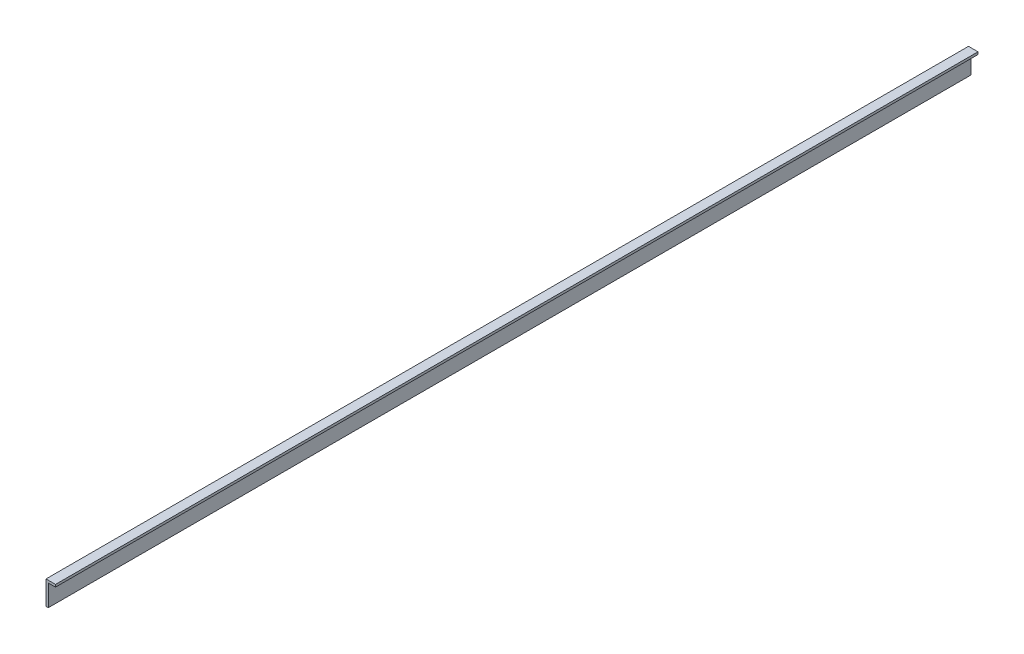
ISO-10303-21;
HEADER;
FILE_DESCRIPTION(('STEP AP214'),'2;1');
FILE_NAME('part.step','',(''),(''),'','','');
FILE_SCHEMA(('AUTOMOTIVE_DESIGN { 1 0 10303 214 1 1 1 1 }'));
ENDSEC;
DATA;
#1=APPLICATION_CONTEXT('core data for automotive mechanical design processes');
#2=APPLICATION_PROTOCOL_DEFINITION('international standard','automotive_design',2000,#1);
#3=PRODUCT_CONTEXT('',#1,'mechanical');
#4=PRODUCT('Part','Part','',(#3));
#5=PRODUCT_RELATED_PRODUCT_CATEGORY('part','',(#4));
#6=PRODUCT_DEFINITION_FORMATION('','',#4);
#7=PRODUCT_DEFINITION_CONTEXT('part definition',#1,'design');
#8=PRODUCT_DEFINITION('design','',#6,#7);
#9=PRODUCT_DEFINITION_SHAPE('','',#8);
#10=(LENGTH_UNIT() NAMED_UNIT(*) SI_UNIT(.MILLI.,.METRE.));
#11=(NAMED_UNIT(*) PLANE_ANGLE_UNIT() SI_UNIT($,.RADIAN.));
#12=(NAMED_UNIT(*) SI_UNIT($,.STERADIAN.) SOLID_ANGLE_UNIT());
#13=UNCERTAINTY_MEASURE_WITH_UNIT(LENGTH_MEASURE(1.E-05),#10,'distance_accuracy_value','');
#14=(GEOMETRIC_REPRESENTATION_CONTEXT(3) GLOBAL_UNCERTAINTY_ASSIGNED_CONTEXT((#13)) GLOBAL_UNIT_ASSIGNED_CONTEXT((#10,
#11,#12)) REPRESENTATION_CONTEXT('',''));
#15=CARTESIAN_POINT('',(0.,0.,0.));
#16=DIRECTION('',(0.,0.,1.));
#17=DIRECTION('',(1.,0.,0.));
#18=AXIS2_PLACEMENT_3D('',#15,#16,#17);
#19=CARTESIAN_POINT('',(-54.,18.,-797.5));
#20=DIRECTION('',(1.,0.,0.));
#21=DIRECTION('',(0.,0.,-1.));
#22=AXIS2_PLACEMENT_3D('',#19,#20,#21);
#23=PLANE('',#22);
#24=DIRECTION('',(0.,1.,0.));
#25=VECTOR('',#24,1.);
#26=CARTESIAN_POINT('',(-54.,18.,-20.));
#27=LINE('',#26,#25);
#28=CARTESIAN_POINT('',(-54.,0.,-20.));
#29=VERTEX_POINT('',#28);
#30=CARTESIAN_POINT('',(-54.,18.,-20.));
#31=VERTEX_POINT('',#30);
#32=EDGE_CURVE('E124',#29,#31,#27,.T.);
#33=ORIENTED_EDGE('',*,*,#32,.F.);
#34=DIRECTION('',(0.,0.,1.));
#35=VECTOR('',#34,1.);
#36=CARTESIAN_POINT('',(-54.,0.,-797.5));
#37=LINE('',#36,#35);
#38=CARTESIAN_POINT('',(-54.,0.,-797.5));
#39=VERTEX_POINT('',#38);
#40=EDGE_CURVE('E11',#39,#29,#37,.T.);
#41=ORIENTED_EDGE('',*,*,#40,.F.);
#42=DIRECTION('',(0.,1.,0.));
#43=VECTOR('',#42,1.);
#44=CARTESIAN_POINT('',(-54.,18.,-797.5));
#45=LINE('',#44,#43);
#46=CARTESIAN_POINT('',(-54.,18.,-797.5));
#47=VERTEX_POINT('',#46);
#48=EDGE_CURVE('E138',#39,#47,#45,.T.);
#49=ORIENTED_EDGE('',*,*,#48,.T.);
#50=DIRECTION('',(0.,0.,1.));
#51=VECTOR('',#50,1.);
#52=CARTESIAN_POINT('',(-54.,18.,-797.5));
#53=LINE('',#52,#51);
#54=EDGE_CURVE('E42',#47,#31,#53,.T.);
#55=ORIENTED_EDGE('',*,*,#54,.T.);
#56=EDGE_LOOP('',(#33,#41,#49,#55));
#57=FACE_BOUND('',#56,.T.);
#58=ADVANCED_FACE('F39',(#57),#23,.T.);
#59=CARTESIAN_POINT('',(-54.,0.,-797.5));
#60=DIRECTION('',(0.,-1.,0.));
#61=DIRECTION('',(0.,0.,-1.));
#62=AXIS2_PLACEMENT_3D('',#59,#60,#61);
#63=PLANE('',#62);
#64=DIRECTION('',(1.,0.,0.));
#65=VECTOR('',#64,1.);
#66=CARTESIAN_POINT('',(-54.,0.,-20.));
#67=LINE('',#66,#65);
#68=CARTESIAN_POINT('',(-56.,0.,-20.));
#69=VERTEX_POINT('',#68);
#70=EDGE_CURVE('E136',#69,#29,#67,.T.);
#71=ORIENTED_EDGE('',*,*,#70,.F.);
#72=DIRECTION('',(0.,0.,1.));
#73=VECTOR('',#72,1.);
#74=CARTESIAN_POINT('',(-56.,0.,-797.5));
#75=LINE('',#74,#73);
#76=CARTESIAN_POINT('',(-56.,0.,-797.5));
#77=VERTEX_POINT('',#76);
#78=EDGE_CURVE('E48',#77,#69,#75,.T.);
#79=ORIENTED_EDGE('',*,*,#78,.F.);
#80=DIRECTION('',(1.,0.,0.));
#81=VECTOR('',#80,1.);
#82=CARTESIAN_POINT('',(-54.,0.,-797.5));
#83=LINE('',#82,#81);
#84=EDGE_CURVE('E114',#77,#39,#83,.T.);
#85=ORIENTED_EDGE('',*,*,#84,.T.);
#86=ORIENTED_EDGE('',*,*,#40,.T.);
#87=EDGE_LOOP('',(#71,#79,#85,#86));
#88=FACE_BOUND('',#87,.T.);
#89=ADVANCED_FACE('F146',(#88),#63,.T.);
#90=CARTESIAN_POINT('',(-56.,0.,-797.5));
#91=DIRECTION('',(-1.,0.,0.));
#92=DIRECTION('',(0.,0.,1.));
#93=AXIS2_PLACEMENT_3D('',#90,#91,#92);
#94=PLANE('',#93);
#95=DIRECTION('',(0.,-1.,0.));
#96=VECTOR('',#95,1.);
#97=CARTESIAN_POINT('',(-56.,0.,-20.));
#98=LINE('',#97,#96);
#99=CARTESIAN_POINT('',(-56.,20.,-20.));
#100=VERTEX_POINT('',#99);
#101=EDGE_CURVE('E101',#100,#69,#98,.T.);
#102=ORIENTED_EDGE('',*,*,#101,.F.);
#103=DIRECTION('',(0.,0.,1.));
#104=VECTOR('',#103,1.);
#105=CARTESIAN_POINT('',(-56.,20.,-797.5));
#106=LINE('',#105,#104);
#107=CARTESIAN_POINT('',(-56.,20.,-797.5));
#108=VERTEX_POINT('',#107);
#109=EDGE_CURVE('E96',#108,#100,#106,.T.);
#110=ORIENTED_EDGE('',*,*,#109,.F.);
#111=DIRECTION('',(0.,-1.,0.));
#112=VECTOR('',#111,1.);
#113=CARTESIAN_POINT('',(-56.,0.,-797.5));
#114=LINE('',#113,#112);
#115=EDGE_CURVE('E99',#108,#77,#114,.T.);
#116=ORIENTED_EDGE('',*,*,#115,.T.);
#117=ORIENTED_EDGE('',*,*,#78,.T.);
#118=EDGE_LOOP('',(#102,#110,#116,#117));
#119=FACE_BOUND('',#118,.T.);
#120=ADVANCED_FACE('F98',(#119),#94,.T.);
#121=CARTESIAN_POINT('',(-56.,20.,-797.5));
#122=DIRECTION('',(0.,1.,0.));
#123=DIRECTION('',(0.,0.,1.));
#124=AXIS2_PLACEMENT_3D('',#121,#122,#123);
#125=PLANE('',#124);
#126=DIRECTION('',(-1.,0.,0.));
#127=VECTOR('',#126,1.);
#128=CARTESIAN_POINT('',(-56.,20.,-20.));
#129=LINE('',#128,#127);
#130=CARTESIAN_POINT('',(-48.,20.,-20.));
#131=VERTEX_POINT('',#130);
#132=EDGE_CURVE('E133',#131,#100,#129,.T.);
#133=ORIENTED_EDGE('',*,*,#132,.F.);
#134=DIRECTION('',(0.,0.,1.));
#135=VECTOR('',#134,1.);
#136=CARTESIAN_POINT('',(-48.,20.,-797.5));
#137=LINE('',#136,#135);
#138=CARTESIAN_POINT('',(-48.,20.,-797.5));
#139=VERTEX_POINT('',#138);
#140=EDGE_CURVE('E106',#139,#131,#137,.T.);
#141=ORIENTED_EDGE('',*,*,#140,.F.);
#142=DIRECTION('',(-1.,0.,0.));
#143=VECTOR('',#142,1.);
#144=CARTESIAN_POINT('',(-56.,20.,-797.5));
#145=LINE('',#144,#143);
#146=EDGE_CURVE('E112',#139,#108,#145,.T.);
#147=ORIENTED_EDGE('',*,*,#146,.T.);
#148=ORIENTED_EDGE('',*,*,#109,.T.);
#149=EDGE_LOOP('',(#133,#141,#147,#148));
#150=FACE_BOUND('',#149,.T.);
#151=ADVANCED_FACE('F116',(#150),#125,.T.);
#152=CARTESIAN_POINT('',(-48.,20.,-797.5));
#153=DIRECTION('',(1.,0.,0.));
#154=DIRECTION('',(0.,0.,-1.));
#155=AXIS2_PLACEMENT_3D('',#152,#153,#154);
#156=PLANE('',#155);
#157=DIRECTION('',(0.,1.,0.));
#158=VECTOR('',#157,1.);
#159=CARTESIAN_POINT('',(-48.,20.,-20.));
#160=LINE('',#159,#158);
#161=CARTESIAN_POINT('',(-48.,18.,-20.));
#162=VERTEX_POINT('',#161);
#163=EDGE_CURVE('E130',#162,#131,#160,.T.);
#164=ORIENTED_EDGE('',*,*,#163,.F.);
#165=DIRECTION('',(0.,0.,1.));
#166=VECTOR('',#165,1.);
#167=CARTESIAN_POINT('',(-48.,18.,-797.5));
#168=LINE('',#167,#166);
#169=CARTESIAN_POINT('',(-48.,18.,-797.5));
#170=VERTEX_POINT('',#169);
#171=EDGE_CURVE('E141',#170,#162,#168,.T.);
#172=ORIENTED_EDGE('',*,*,#171,.F.);
#173=DIRECTION('',(0.,1.,0.));
#174=VECTOR('',#173,1.);
#175=CARTESIAN_POINT('',(-48.,20.,-797.5));
#176=LINE('',#175,#174);
#177=EDGE_CURVE('E117',#170,#139,#176,.T.);
#178=ORIENTED_EDGE('',*,*,#177,.T.);
#179=ORIENTED_EDGE('',*,*,#140,.T.);
#180=EDGE_LOOP('',(#164,#172,#178,#179));
#181=FACE_BOUND('',#180,.T.);
#182=ADVANCED_FACE('F159',(#181),#156,.T.);
#183=CARTESIAN_POINT('',(-48.,18.,-797.5));
#184=DIRECTION('',(0.,-1.,0.));
#185=DIRECTION('',(0.,0.,-1.));
#186=AXIS2_PLACEMENT_3D('',#183,#184,#185);
#187=PLANE('',#186);
#188=DIRECTION('',(1.,0.,0.));
#189=VECTOR('',#188,1.);
#190=CARTESIAN_POINT('',(-48.,18.,-20.));
#191=LINE('',#190,#189);
#192=EDGE_CURVE('E127',#31,#162,#191,.T.);
#193=ORIENTED_EDGE('',*,*,#192,.F.);
#194=ORIENTED_EDGE('',*,*,#54,.F.);
#195=DIRECTION('',(1.,0.,0.));
#196=VECTOR('',#195,1.);
#197=CARTESIAN_POINT('',(-48.,18.,-797.5));
#198=LINE('',#197,#196);
#199=EDGE_CURVE('E119',#47,#170,#198,.T.);
#200=ORIENTED_EDGE('',*,*,#199,.T.);
#201=ORIENTED_EDGE('',*,*,#171,.T.);
#202=EDGE_LOOP('',(#193,#194,#200,#201));
#203=FACE_BOUND('',#202,.T.);
#204=ADVANCED_FACE('F143',(#203),#187,.T.);
#205=CARTESIAN_POINT('',(0.,0.,-797.5));
#206=DIRECTION('',(0.,0.,-1.));
#207=DIRECTION('',(-1.,0.,0.));
#208=AXIS2_PLACEMENT_3D('',#205,#206,#207);
#209=PLANE('',#208);
#210=ORIENTED_EDGE('',*,*,#48,.F.);
#211=ORIENTED_EDGE('',*,*,#84,.F.);
#212=ORIENTED_EDGE('',*,*,#115,.F.);
#213=ORIENTED_EDGE('',*,*,#146,.F.);
#214=ORIENTED_EDGE('',*,*,#177,.F.);
#215=ORIENTED_EDGE('',*,*,#199,.F.);
#216=EDGE_LOOP('',(#210,#211,#212,#213,#214,#215));
#217=FACE_BOUND('',#216,.T.);
#218=ADVANCED_FACE('F110',(#217),#209,.T.);
#219=CARTESIAN_POINT('',(0.,0.,-20.));
#220=DIRECTION('',(0.,0.,-1.));
#221=DIRECTION('',(-1.,0.,0.));
#222=AXIS2_PLACEMENT_3D('',#219,#220,#221);
#223=PLANE('',#222);
#224=ORIENTED_EDGE('',*,*,#32,.T.);
#225=ORIENTED_EDGE('',*,*,#192,.T.);
#226=ORIENTED_EDGE('',*,*,#163,.T.);
#227=ORIENTED_EDGE('',*,*,#132,.T.);
#228=ORIENTED_EDGE('',*,*,#101,.T.);
#229=ORIENTED_EDGE('',*,*,#70,.T.);
#230=EDGE_LOOP('',(#224,#225,#226,#227,#228,#229));
#231=FACE_BOUND('',#230,.T.);
#232=ADVANCED_FACE('F145',(#231),#223,.F.);
#233=CLOSED_SHELL('',(#58,#89,#120,#151,#182,#204,#218,#232));
#234=MANIFOLD_SOLID_BREP('B2',#233);
#235=ADVANCED_BREP_SHAPE_REPRESENTATION('',(#18,#234),#14);
#236=SHAPE_DEFINITION_REPRESENTATION(#9,#235);
ENDSEC;
END-ISO-10303-21;
